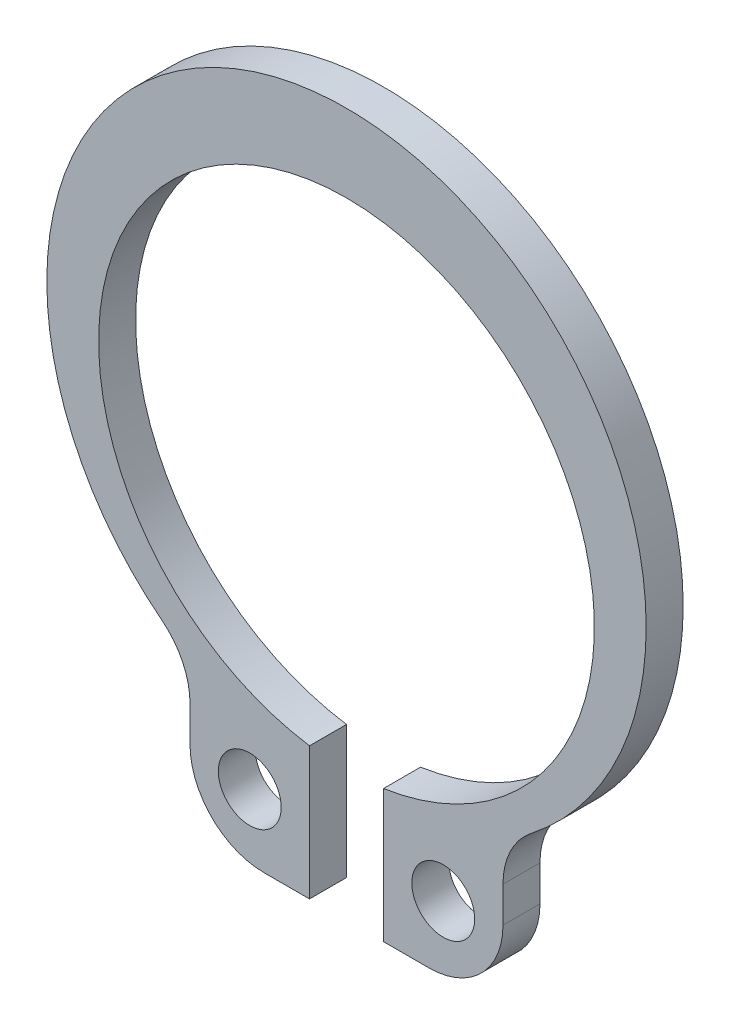
ISO-10303-21;
HEADER;
FILE_DESCRIPTION(('STEP AP214'),'2;1');
FILE_NAME('part.step','',(''),(''),'','','');
FILE_SCHEMA(('AUTOMOTIVE_DESIGN { 1 0 10303 214 1 1 1 1 }'));
ENDSEC;
DATA;
#1=APPLICATION_CONTEXT('core data for automotive mechanical design processes');
#2=APPLICATION_PROTOCOL_DEFINITION('international standard','automotive_design',2000,#1);
#3=PRODUCT_CONTEXT('',#1,'mechanical');
#4=PRODUCT('Part','Part','',(#3));
#5=PRODUCT_RELATED_PRODUCT_CATEGORY('part','',(#4));
#6=PRODUCT_DEFINITION_FORMATION('','',#4);
#7=PRODUCT_DEFINITION_CONTEXT('part definition',#1,'design');
#8=PRODUCT_DEFINITION('design','',#6,#7);
#9=PRODUCT_DEFINITION_SHAPE('','',#8);
#10=(LENGTH_UNIT() NAMED_UNIT(*) SI_UNIT(.MILLI.,.METRE.));
#11=(NAMED_UNIT(*) PLANE_ANGLE_UNIT() SI_UNIT($,.RADIAN.));
#12=(NAMED_UNIT(*) SI_UNIT($,.STERADIAN.) SOLID_ANGLE_UNIT());
#13=UNCERTAINTY_MEASURE_WITH_UNIT(LENGTH_MEASURE(1.E-05),#10,'distance_accuracy_value','');
#14=(GEOMETRIC_REPRESENTATION_CONTEXT(3) GLOBAL_UNCERTAINTY_ASSIGNED_CONTEXT((#13)) GLOBAL_UNIT_ASSIGNED_CONTEXT((#10,
#11,#12)) REPRESENTATION_CONTEXT('',''));
#15=CARTESIAN_POINT('',(0.,0.,0.));
#16=DIRECTION('',(0.,0.,1.));
#17=DIRECTION('',(1.,0.,0.));
#18=AXIS2_PLACEMENT_3D('',#15,#16,#17);
#19=CARTESIAN_POINT('',(-6.22951146434731,-7.25004320211943,1.));
#20=DIRECTION('',(0.,0.,-1.));
#21=DIRECTION('',(-1.,0.,0.));
#22=AXIS2_PLACEMENT_3D('',#19,#20,#21);
#23=CYLINDRICAL_SURFACE('',#22,2.);
#24=CARTESIAN_POINT('',(-6.22951146434731,-7.25004320211943,0.));
#25=DIRECTION('',(0.,0.,1.));
#26=DIRECTION('',(1.,0.,0.));
#27=AXIS2_PLACEMENT_3D('',#24,#25,#26);
#28=CIRCLE('',#27,2.);
#29=CARTESIAN_POINT('',(-4.22951146434731,-7.25004320211943,0.));
#30=VERTEX_POINT('',#29);
#31=CARTESIAN_POINT('',(-4.99594483774389,-5.67577722150172,0.));
#32=VERTEX_POINT('',#31);
#33=EDGE_CURVE('E126',#30,#32,#28,.T.);
#34=ORIENTED_EDGE('',*,*,#33,.F.);
#35=DIRECTION('',(0.,0.,-1.));
#36=VECTOR('',#35,1.);
#37=CARTESIAN_POINT('',(-4.22951146434731,-7.25004320211943,1.));
#38=LINE('',#37,#36);
#39=CARTESIAN_POINT('',(-4.22951146434731,-7.25004320211943,1.));
#40=VERTEX_POINT('',#39);
#41=EDGE_CURVE('E31',#40,#30,#38,.T.);
#42=ORIENTED_EDGE('',*,*,#41,.F.);
#43=CARTESIAN_POINT('',(-6.22951146434731,-7.25004320211943,1.));
#44=DIRECTION('',(0.,0.,1.));
#45=DIRECTION('',(1.,0.,0.));
#46=AXIS2_PLACEMENT_3D('',#43,#44,#45);
#47=CIRCLE('',#46,2.);
#48=CARTESIAN_POINT('',(-4.99594483774389,-5.67577722150172,1.));
#49=VERTEX_POINT('',#48);
#50=EDGE_CURVE('E156',#40,#49,#47,.T.);
#51=ORIENTED_EDGE('',*,*,#50,.T.);
#52=DIRECTION('',(0.,0.,-1.));
#53=VECTOR('',#52,1.);
#54=CARTESIAN_POINT('',(-4.99594483774389,-5.67577722150172,1.));
#55=LINE('',#54,#53);
#56=EDGE_CURVE('E11',#49,#32,#55,.T.);
#57=ORIENTED_EDGE('',*,*,#56,.T.);
#58=EDGE_LOOP('',(#34,#42,#51,#57));
#59=FACE_BOUND('',#58,.T.);
#60=ADVANCED_FACE('F17',(#59),#23,.F.);
#61=CARTESIAN_POINT('',(0.,0.7,1.));
#62=DIRECTION('',(0.,0.,-1.));
#63=DIRECTION('',(-1.,0.,0.));
#64=AXIS2_PLACEMENT_3D('',#61,#62,#63);
#65=CYLINDRICAL_SURFACE('',#64,8.1);
#66=CARTESIAN_POINT('',(0.,0.7,0.));
#67=DIRECTION('',(0.,0.,1.));
#68=DIRECTION('',(1.,0.,0.));
#69=AXIS2_PLACEMENT_3D('',#66,#67,#68);
#70=CIRCLE('',#69,8.1);
#71=CARTESIAN_POINT('',(4.99594483774389,-5.67577722150172,0.));
#72=VERTEX_POINT('',#71);
#73=EDGE_CURVE('E108',#72,#32,#70,.T.);
#74=ORIENTED_EDGE('',*,*,#73,.T.);
#75=ORIENTED_EDGE('',*,*,#56,.F.);
#76=CARTESIAN_POINT('',(0.,0.7,1.));
#77=DIRECTION('',(0.,0.,1.));
#78=DIRECTION('',(1.,0.,0.));
#79=AXIS2_PLACEMENT_3D('',#76,#77,#78);
#80=CIRCLE('',#79,8.1);
#81=CARTESIAN_POINT('',(4.99594483774389,-5.67577722150172,1.));
#82=VERTEX_POINT('',#81);
#83=EDGE_CURVE('E111',#82,#49,#80,.T.);
#84=ORIENTED_EDGE('',*,*,#83,.F.);
#85=DIRECTION('',(0.,0.,-1.));
#86=VECTOR('',#85,1.);
#87=CARTESIAN_POINT('',(4.99594483774389,-5.67577722150172,1.));
#88=LINE('',#87,#86);
#89=EDGE_CURVE('E20',#82,#72,#88,.T.);
#90=ORIENTED_EDGE('',*,*,#89,.T.);
#91=EDGE_LOOP('',(#74,#75,#84,#90));
#92=FACE_BOUND('',#91,.T.);
#93=ADVANCED_FACE('F106',(#92),#65,.T.);
#94=CARTESIAN_POINT('',(6.22951146434731,-7.25004320211943,1.));
#95=DIRECTION('',(0.,0.,-1.));
#96=DIRECTION('',(-1.,0.,0.));
#97=AXIS2_PLACEMENT_3D('',#94,#95,#96);
#98=CYLINDRICAL_SURFACE('',#97,2.);
#99=CARTESIAN_POINT('',(6.22951146434731,-7.25004320211943,0.));
#100=DIRECTION('',(0.,0.,1.));
#101=DIRECTION('',(1.,0.,0.));
#102=AXIS2_PLACEMENT_3D('',#99,#100,#101);
#103=CIRCLE('',#102,2.);
#104=CARTESIAN_POINT('',(4.22951146434731,-7.25004320211943,0.));
#105=VERTEX_POINT('',#104);
#106=EDGE_CURVE('E117',#72,#105,#103,.T.);
#107=ORIENTED_EDGE('',*,*,#106,.F.);
#108=ORIENTED_EDGE('',*,*,#89,.F.);
#109=CARTESIAN_POINT('',(6.22951146434731,-7.25004320211943,1.));
#110=DIRECTION('',(0.,0.,1.));
#111=DIRECTION('',(1.,0.,0.));
#112=AXIS2_PLACEMENT_3D('',#109,#110,#111);
#113=CIRCLE('',#112,2.);
#114=CARTESIAN_POINT('',(4.22951146434731,-7.25004320211943,1.));
#115=VERTEX_POINT('',#114);
#116=EDGE_CURVE('E159',#82,#115,#113,.T.);
#117=ORIENTED_EDGE('',*,*,#116,.T.);
#118=DIRECTION('',(0.,0.,-1.));
#119=VECTOR('',#118,1.);
#120=CARTESIAN_POINT('',(4.22951146434731,-7.25004320211943,1.));
#121=LINE('',#120,#119);
#122=EDGE_CURVE('E115',#115,#105,#121,.T.);
#123=ORIENTED_EDGE('',*,*,#122,.T.);
#124=EDGE_LOOP('',(#107,#108,#117,#123));
#125=FACE_BOUND('',#124,.T.);
#126=ADVANCED_FACE('F118',(#125),#98,.F.);
#127=CARTESIAN_POINT('',(4.22951146434731,-8.21,1.));
#128=DIRECTION('',(-1.,0.,0.));
#129=DIRECTION('',(0.,0.,1.));
#130=AXIS2_PLACEMENT_3D('',#127,#128,#129);
#131=PLANE('',#130);
#132=DIRECTION('',(0.,1.,0.));
#133=VECTOR('',#132,1.);
#134=CARTESIAN_POINT('',(4.22951146434731,-8.21,0.));
#135=LINE('',#134,#133);
#136=CARTESIAN_POINT('',(4.22951146434731,-8.21,0.));
#137=VERTEX_POINT('',#136);
#138=EDGE_CURVE('E122',#137,#105,#135,.T.);
#139=ORIENTED_EDGE('',*,*,#138,.T.);
#140=ORIENTED_EDGE('',*,*,#122,.F.);
#141=DIRECTION('',(0.,1.,0.));
#142=VECTOR('',#141,1.);
#143=CARTESIAN_POINT('',(4.22951146434731,-8.21,1.));
#144=LINE('',#143,#142);
#145=CARTESIAN_POINT('',(4.22951146434731,-8.21,1.));
#146=VERTEX_POINT('',#145);
#147=EDGE_CURVE('E161',#146,#115,#144,.T.);
#148=ORIENTED_EDGE('',*,*,#147,.F.);
#149=DIRECTION('',(0.,0.,-1.));
#150=VECTOR('',#149,1.);
#151=CARTESIAN_POINT('',(4.22951146434731,-8.21,1.));
#152=LINE('',#151,#150);
#153=EDGE_CURVE('E203',#146,#137,#152,.T.);
#154=ORIENTED_EDGE('',*,*,#153,.T.);
#155=EDGE_LOOP('',(#139,#140,#148,#154));
#156=FACE_BOUND('',#155,.T.);
#157=ADVANCED_FACE('F207',(#156),#131,.F.);
#158=CARTESIAN_POINT('',(2.22951146434731,-8.21,1.));
#159=DIRECTION('',(0.,0.,-1.));
#160=DIRECTION('',(-1.,0.,0.));
#161=AXIS2_PLACEMENT_3D('',#158,#159,#160);
#162=CYLINDRICAL_SURFACE('',#161,2.);
#163=CARTESIAN_POINT('',(2.22951146434731,-8.21,0.));
#164=DIRECTION('',(0.,0.,1.));
#165=DIRECTION('',(1.,0.,0.));
#166=AXIS2_PLACEMENT_3D('',#163,#164,#165);
#167=CIRCLE('',#166,2.);
#168=CARTESIAN_POINT('',(2.22951146434731,-10.21,0.));
#169=VERTEX_POINT('',#168);
#170=EDGE_CURVE('E134',#169,#137,#167,.T.);
#171=ORIENTED_EDGE('',*,*,#170,.T.);
#172=ORIENTED_EDGE('',*,*,#153,.F.);
#173=CARTESIAN_POINT('',(2.22951146434731,-8.21,1.));
#174=DIRECTION('',(0.,0.,1.));
#175=DIRECTION('',(1.,0.,0.));
#176=AXIS2_PLACEMENT_3D('',#173,#174,#175);
#177=CIRCLE('',#176,2.);
#178=CARTESIAN_POINT('',(2.22951146434731,-10.21,1.));
#179=VERTEX_POINT('',#178);
#180=EDGE_CURVE('E164',#179,#146,#177,.T.);
#181=ORIENTED_EDGE('',*,*,#180,.F.);
#182=DIRECTION('',(0.,0.,-1.));
#183=VECTOR('',#182,1.);
#184=CARTESIAN_POINT('',(2.22951146434731,-10.21,1.));
#185=LINE('',#184,#183);
#186=EDGE_CURVE('E201',#179,#169,#185,.T.);
#187=ORIENTED_EDGE('',*,*,#186,.T.);
#188=EDGE_LOOP('',(#171,#172,#181,#187));
#189=FACE_BOUND('',#188,.T.);
#190=ADVANCED_FACE('F211',(#189),#162,.T.);
#191=CARTESIAN_POINT('',(1.,-10.21,1.));
#192=DIRECTION('',(0.,1.,0.));
#193=DIRECTION('',(-1.,0.,0.));
#194=AXIS2_PLACEMENT_3D('',#191,#192,#193);
#195=PLANE('',#194);
#196=DIRECTION('',(1.,0.,0.));
#197=VECTOR('',#196,1.);
#198=CARTESIAN_POINT('',(1.,-10.21,0.));
#199=LINE('',#198,#197);
#200=CARTESIAN_POINT('',(1.,-10.21,0.));
#201=VERTEX_POINT('',#200);
#202=EDGE_CURVE('E137',#201,#169,#199,.T.);
#203=ORIENTED_EDGE('',*,*,#202,.T.);
#204=ORIENTED_EDGE('',*,*,#186,.F.);
#205=DIRECTION('',(1.,0.,0.));
#206=VECTOR('',#205,1.);
#207=CARTESIAN_POINT('',(1.,-10.21,1.));
#208=LINE('',#207,#206);
#209=CARTESIAN_POINT('',(1.,-10.21,1.));
#210=VERTEX_POINT('',#209);
#211=EDGE_CURVE('E167',#210,#179,#208,.T.);
#212=ORIENTED_EDGE('',*,*,#211,.F.);
#213=DIRECTION('',(0.,0.,-1.));
#214=VECTOR('',#213,1.);
#215=CARTESIAN_POINT('',(1.,-10.21,1.));
#216=LINE('',#215,#214);
#217=EDGE_CURVE('E199',#210,#201,#216,.T.);
#218=ORIENTED_EDGE('',*,*,#217,.T.);
#219=EDGE_LOOP('',(#203,#204,#212,#218));
#220=FACE_BOUND('',#219,.T.);
#221=ADVANCED_FACE('F215',(#220),#195,.F.);
#222=CARTESIAN_POINT('',(1.,-10.21,1.));
#223=DIRECTION('',(-1.,0.,0.));
#224=DIRECTION('',(0.,-1.,0.));
#225=AXIS2_PLACEMENT_3D('',#222,#223,#224);
#226=PLANE('',#225);
#227=DIRECTION('',(0.,1.,0.));
#228=VECTOR('',#227,1.);
#229=CARTESIAN_POINT('',(1.,-10.21,0.));
#230=LINE('',#229,#228);
#231=CARTESIAN_POINT('',(1.,-6.62495283002075,0.));
#232=VERTEX_POINT('',#231);
#233=EDGE_CURVE('E140',#201,#232,#230,.T.);
#234=ORIENTED_EDGE('',*,*,#233,.F.);
#235=ORIENTED_EDGE('',*,*,#217,.F.);
#236=DIRECTION('',(0.,1.,0.));
#237=VECTOR('',#236,1.);
#238=CARTESIAN_POINT('',(1.,-10.21,1.));
#239=LINE('',#238,#237);
#240=CARTESIAN_POINT('',(1.,-6.62495283002075,1.));
#241=VERTEX_POINT('',#240);
#242=EDGE_CURVE('E170',#210,#241,#239,.T.);
#243=ORIENTED_EDGE('',*,*,#242,.T.);
#244=DIRECTION('',(0.,0.,-1.));
#245=VECTOR('',#244,1.);
#246=CARTESIAN_POINT('',(1.,-6.62495283002075,1.));
#247=LINE('',#246,#245);
#248=EDGE_CURVE('E197',#241,#232,#247,.T.);
#249=ORIENTED_EDGE('',*,*,#248,.T.);
#250=EDGE_LOOP('',(#234,#235,#243,#249));
#251=FACE_BOUND('',#250,.T.);
#252=ADVANCED_FACE('F219',(#251),#226,.T.);
#253=CARTESIAN_POINT('',(0.,0.,1.));
#254=DIRECTION('',(0.,0.,-1.));
#255=DIRECTION('',(-1.,0.,0.));
#256=AXIS2_PLACEMENT_3D('',#253,#254,#255);
#257=CYLINDRICAL_SURFACE('',#256,6.7);
#258=CARTESIAN_POINT('',(0.,0.,0.));
#259=DIRECTION('',(0.,0.,1.));
#260=DIRECTION('',(1.,0.,0.));
#261=AXIS2_PLACEMENT_3D('',#258,#259,#260);
#262=CIRCLE('',#261,6.7);
#263=CARTESIAN_POINT('',(-1.,-6.62495283002075,0.));
#264=VERTEX_POINT('',#263);
#265=EDGE_CURVE('E143',#232,#264,#262,.T.);
#266=ORIENTED_EDGE('',*,*,#265,.F.);
#267=ORIENTED_EDGE('',*,*,#248,.F.);
#268=CARTESIAN_POINT('',(0.,0.,1.));
#269=DIRECTION('',(0.,0.,1.));
#270=DIRECTION('',(1.,0.,0.));
#271=AXIS2_PLACEMENT_3D('',#268,#269,#270);
#272=CIRCLE('',#271,6.7);
#273=CARTESIAN_POINT('',(-1.,-6.62495283002075,1.));
#274=VERTEX_POINT('',#273);
#275=EDGE_CURVE('E173',#241,#274,#272,.T.);
#276=ORIENTED_EDGE('',*,*,#275,.T.);
#277=DIRECTION('',(0.,0.,-1.));
#278=VECTOR('',#277,1.);
#279=CARTESIAN_POINT('',(-1.,-6.62495283002075,1.));
#280=LINE('',#279,#278);
#281=EDGE_CURVE('E195',#274,#264,#280,.T.);
#282=ORIENTED_EDGE('',*,*,#281,.T.);
#283=EDGE_LOOP('',(#266,#267,#276,#282));
#284=FACE_BOUND('',#283,.T.);
#285=ADVANCED_FACE('F223',(#284),#257,.F.);
#286=CARTESIAN_POINT('',(-1.,-10.21,1.));
#287=DIRECTION('',(-1.,0.,0.));
#288=DIRECTION('',(0.,-1.,0.));
#289=AXIS2_PLACEMENT_3D('',#286,#287,#288);
#290=PLANE('',#289);
#291=DIRECTION('',(0.,1.,0.));
#292=VECTOR('',#291,1.);
#293=CARTESIAN_POINT('',(-1.,-10.21,0.));
#294=LINE('',#293,#292);
#295=CARTESIAN_POINT('',(-1.,-10.21,0.));
#296=VERTEX_POINT('',#295);
#297=EDGE_CURVE('E146',#296,#264,#294,.T.);
#298=ORIENTED_EDGE('',*,*,#297,.T.);
#299=ORIENTED_EDGE('',*,*,#281,.F.);
#300=DIRECTION('',(0.,1.,0.));
#301=VECTOR('',#300,1.);
#302=CARTESIAN_POINT('',(-1.,-10.21,1.));
#303=LINE('',#302,#301);
#304=CARTESIAN_POINT('',(-1.,-10.21,1.));
#305=VERTEX_POINT('',#304);
#306=EDGE_CURVE('E176',#305,#274,#303,.T.);
#307=ORIENTED_EDGE('',*,*,#306,.F.);
#308=DIRECTION('',(0.,0.,-1.));
#309=VECTOR('',#308,1.);
#310=CARTESIAN_POINT('',(-1.,-10.21,1.));
#311=LINE('',#310,#309);
#312=EDGE_CURVE('E193',#305,#296,#311,.T.);
#313=ORIENTED_EDGE('',*,*,#312,.T.);
#314=EDGE_LOOP('',(#298,#299,#307,#313));
#315=FACE_BOUND('',#314,.T.);
#316=ADVANCED_FACE('F228',(#315),#290,.F.);
#317=CARTESIAN_POINT('',(-2.22951146434731,-10.21,1.));
#318=DIRECTION('',(0.,1.,0.));
#319=DIRECTION('',(-1.,0.,0.));
#320=AXIS2_PLACEMENT_3D('',#317,#318,#319);
#321=PLANE('',#320);
#322=DIRECTION('',(1.,0.,0.));
#323=VECTOR('',#322,1.);
#324=CARTESIAN_POINT('',(-2.22951146434731,-10.21,0.));
#325=LINE('',#324,#323);
#326=CARTESIAN_POINT('',(-2.22951146434731,-10.21,0.));
#327=VERTEX_POINT('',#326);
#328=EDGE_CURVE('E149',#327,#296,#325,.T.);
#329=ORIENTED_EDGE('',*,*,#328,.T.);
#330=ORIENTED_EDGE('',*,*,#312,.F.);
#331=DIRECTION('',(1.,0.,0.));
#332=VECTOR('',#331,1.);
#333=CARTESIAN_POINT('',(-2.22951146434731,-10.21,1.));
#334=LINE('',#333,#332);
#335=CARTESIAN_POINT('',(-2.22951146434731,-10.21,1.));
#336=VERTEX_POINT('',#335);
#337=EDGE_CURVE('E179',#336,#305,#334,.T.);
#338=ORIENTED_EDGE('',*,*,#337,.F.);
#339=DIRECTION('',(0.,0.,-1.));
#340=VECTOR('',#339,1.);
#341=CARTESIAN_POINT('',(-2.22951146434731,-10.21,1.));
#342=LINE('',#341,#340);
#343=EDGE_CURVE('E191',#336,#327,#342,.T.);
#344=ORIENTED_EDGE('',*,*,#343,.T.);
#345=EDGE_LOOP('',(#329,#330,#338,#344));
#346=FACE_BOUND('',#345,.T.);
#347=ADVANCED_FACE('F232',(#346),#321,.F.);
#348=CARTESIAN_POINT('',(-2.22951146434731,-8.21,1.));
#349=DIRECTION('',(0.,0.,-1.));
#350=DIRECTION('',(-1.,0.,0.));
#351=AXIS2_PLACEMENT_3D('',#348,#349,#350);
#352=CYLINDRICAL_SURFACE('',#351,2.);
#353=CARTESIAN_POINT('',(-2.22951146434731,-8.21,0.));
#354=DIRECTION('',(0.,0.,1.));
#355=DIRECTION('',(1.,0.,0.));
#356=AXIS2_PLACEMENT_3D('',#353,#354,#355);
#357=CIRCLE('',#356,2.);
#358=CARTESIAN_POINT('',(-4.22951146434731,-8.21,0.));
#359=VERTEX_POINT('',#358);
#360=EDGE_CURVE('E152',#359,#327,#357,.T.);
#361=ORIENTED_EDGE('',*,*,#360,.T.);
#362=ORIENTED_EDGE('',*,*,#343,.F.);
#363=CARTESIAN_POINT('',(-2.22951146434731,-8.21,1.));
#364=DIRECTION('',(0.,0.,1.));
#365=DIRECTION('',(1.,0.,0.));
#366=AXIS2_PLACEMENT_3D('',#363,#364,#365);
#367=CIRCLE('',#366,2.);
#368=CARTESIAN_POINT('',(-4.22951146434731,-8.21,1.));
#369=VERTEX_POINT('',#368);
#370=EDGE_CURVE('E182',#369,#336,#367,.T.);
#371=ORIENTED_EDGE('',*,*,#370,.F.);
#372=DIRECTION('',(0.,0.,-1.));
#373=VECTOR('',#372,1.);
#374=CARTESIAN_POINT('',(-4.22951146434731,-8.21,1.));
#375=LINE('',#374,#373);
#376=EDGE_CURVE('E38',#369,#359,#375,.T.);
#377=ORIENTED_EDGE('',*,*,#376,.T.);
#378=EDGE_LOOP('',(#361,#362,#371,#377));
#379=FACE_BOUND('',#378,.T.);
#380=ADVANCED_FACE('F234',(#379),#352,.T.);
#381=CARTESIAN_POINT('',(-4.22951146434731,-7.25004320211943,1.));
#382=DIRECTION('',(1.,0.,0.));
#383=DIRECTION('',(0.,0.,-1.));
#384=AXIS2_PLACEMENT_3D('',#381,#382,#383);
#385=PLANE('',#384);
#386=DIRECTION('',(0.,-1.,0.));
#387=VECTOR('',#386,1.);
#388=CARTESIAN_POINT('',(-4.22951146434731,-7.25004320211943,0.));
#389=LINE('',#388,#387);
#390=EDGE_CURVE('E155',#30,#359,#389,.T.);
#391=ORIENTED_EDGE('',*,*,#390,.T.);
#392=ORIENTED_EDGE('',*,*,#376,.F.);
#393=DIRECTION('',(0.,-1.,0.));
#394=VECTOR('',#393,1.);
#395=CARTESIAN_POINT('',(-4.22951146434731,-7.25004320211943,1.));
#396=LINE('',#395,#394);
#397=EDGE_CURVE('E185',#40,#369,#396,.T.);
#398=ORIENTED_EDGE('',*,*,#397,.F.);
#399=ORIENTED_EDGE('',*,*,#41,.T.);
#400=EDGE_LOOP('',(#391,#392,#398,#399));
#401=FACE_BOUND('',#400,.T.);
#402=ADVANCED_FACE('F238',(#401),#385,.F.);
#403=CARTESIAN_POINT('',(-6.22951146434731,-7.25004320211943,1.));
#404=DIRECTION('',(0.,0.,1.));
#405=DIRECTION('',(1.,0.,0.));
#406=AXIS2_PLACEMENT_3D('',#403,#404,#405);
#407=PLANE('',#406);
#408=CARTESIAN_POINT('',(-2.61475573217365,-8.45,1.));
#409=DIRECTION('',(0.,0.,-1.));
#410=DIRECTION('',(0.,1.,0.));
#411=AXIS2_PLACEMENT_3D('',#408,#409,#410);
#412=CIRCLE('',#411,0.85);
#413=CARTESIAN_POINT('',(-2.61475573217365,-7.6,1.));
#414=VERTEX_POINT('',#413);
#415=EDGE_CURVE('E333',#414,#414,#412,.T.);
#416=ORIENTED_EDGE('',*,*,#415,.T.);
#417=EDGE_LOOP('',(#416));
#418=FACE_BOUND('',#417,.T.);
#419=CARTESIAN_POINT('',(2.61475573217365,-8.45,1.));
#420=DIRECTION('',(0.,0.,-1.));
#421=DIRECTION('',(0.,1.,0.));
#422=AXIS2_PLACEMENT_3D('',#419,#420,#421);
#423=CIRCLE('',#422,0.85);
#424=CARTESIAN_POINT('',(2.61475573217365,-7.6,1.));
#425=VERTEX_POINT('',#424);
#426=EDGE_CURVE('E128',#425,#425,#423,.T.);
#427=ORIENTED_EDGE('',*,*,#426,.T.);
#428=EDGE_LOOP('',(#427));
#429=FACE_BOUND('',#428,.T.);
#430=ORIENTED_EDGE('',*,*,#50,.F.);
#431=ORIENTED_EDGE('',*,*,#397,.T.);
#432=ORIENTED_EDGE('',*,*,#370,.T.);
#433=ORIENTED_EDGE('',*,*,#337,.T.);
#434=ORIENTED_EDGE('',*,*,#306,.T.);
#435=ORIENTED_EDGE('',*,*,#275,.F.);
#436=ORIENTED_EDGE('',*,*,#242,.F.);
#437=ORIENTED_EDGE('',*,*,#211,.T.);
#438=ORIENTED_EDGE('',*,*,#180,.T.);
#439=ORIENTED_EDGE('',*,*,#147,.T.);
#440=ORIENTED_EDGE('',*,*,#116,.F.);
#441=ORIENTED_EDGE('',*,*,#83,.T.);
#442=EDGE_LOOP('',(#430,#431,#432,#433,#434,#435,#436,#437,#438,#439,#440,#441));
#443=FACE_BOUND('',#442,.T.);
#444=ADVANCED_FACE('F237',(#418,#429,#443),#407,.T.);
#445=CARTESIAN_POINT('',(-6.22951146434731,-7.25004320211943,0.));
#446=DIRECTION('',(0.,0.,1.));
#447=DIRECTION('',(1.,0.,0.));
#448=AXIS2_PLACEMENT_3D('',#445,#446,#447);
#449=PLANE('',#448);
#450=CARTESIAN_POINT('',(-2.61475573217365,-8.45,0.));
#451=DIRECTION('',(0.,0.,1.));
#452=DIRECTION('',(0.,1.,0.));
#453=AXIS2_PLACEMENT_3D('',#450,#451,#452);
#454=CIRCLE('',#453,0.85);
#455=CARTESIAN_POINT('',(-2.61475573217365,-7.6,0.));
#456=VERTEX_POINT('',#455);
#457=EDGE_CURVE('E336',#456,#456,#454,.T.);
#458=ORIENTED_EDGE('',*,*,#457,.T.);
#459=EDGE_LOOP('',(#458));
#460=FACE_BOUND('',#459,.T.);
#461=CARTESIAN_POINT('',(2.61475573217365,-8.45,0.));
#462=DIRECTION('',(0.,0.,1.));
#463=DIRECTION('',(0.,1.,0.));
#464=AXIS2_PLACEMENT_3D('',#461,#462,#463);
#465=CIRCLE('',#464,0.85);
#466=CARTESIAN_POINT('',(2.61475573217365,-7.6,0.));
#467=VERTEX_POINT('',#466);
#468=EDGE_CURVE('E338',#467,#467,#465,.T.);
#469=ORIENTED_EDGE('',*,*,#468,.T.);
#470=EDGE_LOOP('',(#469));
#471=FACE_BOUND('',#470,.T.);
#472=ORIENTED_EDGE('',*,*,#33,.T.);
#473=ORIENTED_EDGE('',*,*,#73,.F.);
#474=ORIENTED_EDGE('',*,*,#106,.T.);
#475=ORIENTED_EDGE('',*,*,#138,.F.);
#476=ORIENTED_EDGE('',*,*,#170,.F.);
#477=ORIENTED_EDGE('',*,*,#202,.F.);
#478=ORIENTED_EDGE('',*,*,#233,.T.);
#479=ORIENTED_EDGE('',*,*,#265,.T.);
#480=ORIENTED_EDGE('',*,*,#297,.F.);
#481=ORIENTED_EDGE('',*,*,#328,.F.);
#482=ORIENTED_EDGE('',*,*,#360,.F.);
#483=ORIENTED_EDGE('',*,*,#390,.F.);
#484=EDGE_LOOP('',(#472,#473,#474,#475,#476,#477,#478,#479,#480,#481,#482,#483));
#485=FACE_BOUND('',#484,.T.);
#486=ADVANCED_FACE('F124',(#460,#471,#485),#449,.F.);
#487=CARTESIAN_POINT('',(2.61475573217365,-8.45,0.));
#488=DIRECTION('',(0.,0.,1.));
#489=DIRECTION('',(0.,1.,0.));
#490=AXIS2_PLACEMENT_3D('',#487,#488,#489);
#491=CYLINDRICAL_SURFACE('',#490,0.85);
#492=ORIENTED_EDGE('',*,*,#426,.F.);
#493=EDGE_LOOP('',(#492));
#494=FACE_BOUND('',#493,.T.);
#495=ORIENTED_EDGE('',*,*,#468,.F.);
#496=EDGE_LOOP('',(#495));
#497=FACE_BOUND('',#496,.T.);
#498=ADVANCED_FACE('F304',(#494,#497),#491,.F.);
#499=CARTESIAN_POINT('',(-2.61475573217365,-8.45,0.));
#500=DIRECTION('',(0.,0.,1.));
#501=DIRECTION('',(0.,1.,0.));
#502=AXIS2_PLACEMENT_3D('',#499,#500,#501);
#503=CYLINDRICAL_SURFACE('',#502,0.85);
#504=ORIENTED_EDGE('',*,*,#415,.F.);
#505=EDGE_LOOP('',(#504));
#506=FACE_BOUND('',#505,.T.);
#507=ORIENTED_EDGE('',*,*,#457,.F.);
#508=EDGE_LOOP('',(#507));
#509=FACE_BOUND('',#508,.T.);
#510=ADVANCED_FACE('F314',(#506,#509),#503,.F.);
#511=CLOSED_SHELL('',(#60,#93,#126,#157,#190,#221,#252,#285,#316,#347,#380,#402,#444,#486,#498,#510));
#512=MANIFOLD_SOLID_BREP('B1',#511);
#513=ADVANCED_BREP_SHAPE_REPRESENTATION('',(#18,#512),#14);
#514=SHAPE_DEFINITION_REPRESENTATION(#9,#513);
ENDSEC;
END-ISO-10303-21;
